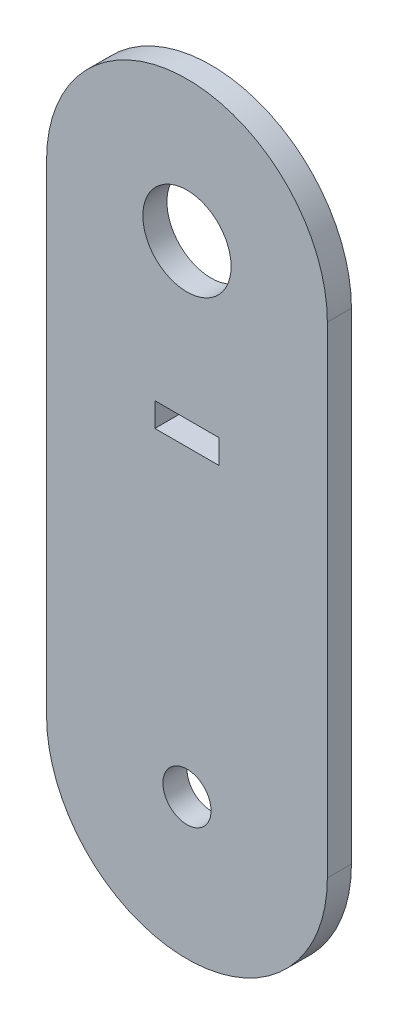
ISO-10303-21;
HEADER;
FILE_DESCRIPTION(('STEP AP214'),'2;1');
FILE_NAME('part.step','',(''),(''),'','','');
FILE_SCHEMA(('AUTOMOTIVE_DESIGN { 1 0 10303 214 1 1 1 1 }'));
ENDSEC;
DATA;
#1=APPLICATION_CONTEXT('core data for automotive mechanical design processes');
#2=APPLICATION_PROTOCOL_DEFINITION('international standard','automotive_design',2000,#1);
#3=PRODUCT_CONTEXT('',#1,'mechanical');
#4=PRODUCT('Part','Part','',(#3));
#5=PRODUCT_RELATED_PRODUCT_CATEGORY('part','',(#4));
#6=PRODUCT_DEFINITION_FORMATION('','',#4);
#7=PRODUCT_DEFINITION_CONTEXT('part definition',#1,'design');
#8=PRODUCT_DEFINITION('design','',#6,#7);
#9=PRODUCT_DEFINITION_SHAPE('','',#8);
#10=(LENGTH_UNIT() NAMED_UNIT(*) SI_UNIT(.MILLI.,.METRE.));
#11=(NAMED_UNIT(*) PLANE_ANGLE_UNIT() SI_UNIT($,.RADIAN.));
#12=(NAMED_UNIT(*) SI_UNIT($,.STERADIAN.) SOLID_ANGLE_UNIT());
#13=UNCERTAINTY_MEASURE_WITH_UNIT(LENGTH_MEASURE(1.E-05),#10,'distance_accuracy_value','');
#14=(GEOMETRIC_REPRESENTATION_CONTEXT(3) GLOBAL_UNCERTAINTY_ASSIGNED_CONTEXT((#13)) GLOBAL_UNIT_ASSIGNED_CONTEXT((#10,
#11,#12)) REPRESENTATION_CONTEXT('',''));
#15=CARTESIAN_POINT('',(0.,0.,0.));
#16=DIRECTION('',(0.,0.,1.));
#17=DIRECTION('',(1.,0.,0.));
#18=AXIS2_PLACEMENT_3D('',#15,#16,#17);
#19=CARTESIAN_POINT('',(0.,30.,3.));
#20=DIRECTION('',(0.,0.,-1.));
#21=DIRECTION('',(-1.,0.,0.));
#22=AXIS2_PLACEMENT_3D('',#19,#20,#21);
#23=PLANE('',#22);
#24=DIRECTION('',(-1.,0.,0.));
#25=VECTOR('',#24,1.);
#26=CARTESIAN_POINT('',(4.,10.77,3.));
#27=LINE('',#26,#25);
#28=CARTESIAN_POINT('',(4.,10.77,3.));
#29=VERTEX_POINT('',#28);
#30=CARTESIAN_POINT('',(-4.,10.77,3.));
#31=VERTEX_POINT('',#30);
#32=EDGE_CURVE('E117',#29,#31,#27,.T.);
#33=ORIENTED_EDGE('',*,*,#32,.F.);
#34=DIRECTION('',(0.,1.,0.));
#35=VECTOR('',#34,1.);
#36=CARTESIAN_POINT('',(4.,10.77,3.));
#37=LINE('',#36,#35);
#38=CARTESIAN_POINT('',(4.,7.77,3.));
#39=VERTEX_POINT('',#38);
#40=EDGE_CURVE('E48',#39,#29,#37,.T.);
#41=ORIENTED_EDGE('',*,*,#40,.F.);
#42=DIRECTION('',(1.,0.,0.));
#43=VECTOR('',#42,1.);
#44=CARTESIAN_POINT('',(4.,7.77,3.));
#45=LINE('',#44,#43);
#46=CARTESIAN_POINT('',(-4.,7.77,3.));
#47=VERTEX_POINT('',#46);
#48=EDGE_CURVE('E110',#47,#39,#45,.T.);
#49=ORIENTED_EDGE('',*,*,#48,.F.);
#50=DIRECTION('',(0.,-1.,0.));
#51=VECTOR('',#50,1.);
#52=CARTESIAN_POINT('',(-4.,10.77,3.));
#53=LINE('',#52,#51);
#54=EDGE_CURVE('E124',#31,#47,#53,.T.);
#55=ORIENTED_EDGE('',*,*,#54,.F.);
#56=EDGE_LOOP('',(#33,#41,#49,#55));
#57=FACE_BOUND('',#56,.T.);
#58=CARTESIAN_POINT('',(0.,30.,3.));
#59=DIRECTION('',(0.,0.,1.));
#60=DIRECTION('',(-1.,0.,0.));
#61=AXIS2_PLACEMENT_3D('',#58,#59,#60);
#62=CIRCLE('',#61,17.5);
#63=CARTESIAN_POINT('',(17.5,30.,3.));
#64=VERTEX_POINT('',#63);
#65=CARTESIAN_POINT('',(-17.5,30.,3.));
#66=VERTEX_POINT('',#65);
#67=EDGE_CURVE('E145',#64,#66,#62,.T.);
#68=ORIENTED_EDGE('',*,*,#67,.T.);
#69=DIRECTION('',(0.,-1.,0.));
#70=VECTOR('',#69,1.);
#71=CARTESIAN_POINT('',(-17.5,-30.,3.));
#72=LINE('',#71,#70);
#73=CARTESIAN_POINT('',(-17.5,-30.,3.));
#74=VERTEX_POINT('',#73);
#75=EDGE_CURVE('E148',#66,#74,#72,.T.);
#76=ORIENTED_EDGE('',*,*,#75,.T.);
#77=CARTESIAN_POINT('',(0.,-30.,3.));
#78=DIRECTION('',(0.,0.,1.));
#79=DIRECTION('',(1.,0.,0.));
#80=AXIS2_PLACEMENT_3D('',#77,#78,#79);
#81=CIRCLE('',#80,17.5);
#82=CARTESIAN_POINT('',(17.5,-30.,3.));
#83=VERTEX_POINT('',#82);
#84=EDGE_CURVE('E151',#74,#83,#81,.T.);
#85=ORIENTED_EDGE('',*,*,#84,.T.);
#86=DIRECTION('',(0.,1.,0.));
#87=VECTOR('',#86,1.);
#88=CARTESIAN_POINT('',(17.5,-30.,3.));
#89=LINE('',#88,#87);
#90=EDGE_CURVE('E153',#83,#64,#89,.T.);
#91=ORIENTED_EDGE('',*,*,#90,.T.);
#92=EDGE_LOOP('',(#68,#76,#85,#91));
#93=FACE_BOUND('',#92,.T.);
#94=CARTESIAN_POINT('',(0.,-30.,3.));
#95=DIRECTION('',(0.,0.,1.));
#96=DIRECTION('',(1.,0.,0.));
#97=AXIS2_PLACEMENT_3D('',#94,#95,#96);
#98=CIRCLE('',#97,3.);
#99=CARTESIAN_POINT('',(3.00000000000001,-30.,3.));
#100=VERTEX_POINT('',#99);
#101=EDGE_CURVE('E139',#100,#100,#98,.T.);
#102=ORIENTED_EDGE('',*,*,#101,.F.);
#103=EDGE_LOOP('',(#102));
#104=FACE_BOUND('',#103,.T.);
#105=CARTESIAN_POINT('',(0.,30.,3.));
#106=DIRECTION('',(0.,0.,1.));
#107=DIRECTION('',(1.,0.,0.));
#108=AXIS2_PLACEMENT_3D('',#105,#106,#107);
#109=CIRCLE('',#108,5.5);
#110=CARTESIAN_POINT('',(5.50000000000001,30.,3.));
#111=VERTEX_POINT('',#110);
#112=EDGE_CURVE('E133',#111,#111,#109,.T.);
#113=ORIENTED_EDGE('',*,*,#112,.F.);
#114=EDGE_LOOP('',(#113));
#115=FACE_BOUND('',#114,.T.);
#116=ADVANCED_FACE('F33',(#57,#93,#104,#115),#23,.F.);
#117=CARTESIAN_POINT('',(0.,30.,0.));
#118=DIRECTION('',(0.,0.,-1.));
#119=DIRECTION('',(-1.,0.,0.));
#120=AXIS2_PLACEMENT_3D('',#117,#118,#119);
#121=PLANE('',#120);
#122=DIRECTION('',(0.,1.,0.));
#123=VECTOR('',#122,1.);
#124=CARTESIAN_POINT('',(4.,10.77,0.));
#125=LINE('',#124,#123);
#126=CARTESIAN_POINT('',(4.,7.77,0.));
#127=VERTEX_POINT('',#126);
#128=CARTESIAN_POINT('',(4.,10.77,0.));
#129=VERTEX_POINT('',#128);
#130=EDGE_CURVE('E108',#127,#129,#125,.T.);
#131=ORIENTED_EDGE('',*,*,#130,.T.);
#132=DIRECTION('',(-1.,0.,0.));
#133=VECTOR('',#132,1.);
#134=CARTESIAN_POINT('',(4.,10.77,0.));
#135=LINE('',#134,#133);
#136=CARTESIAN_POINT('',(-4.,10.77,0.));
#137=VERTEX_POINT('',#136);
#138=EDGE_CURVE('E97',#129,#137,#135,.T.);
#139=ORIENTED_EDGE('',*,*,#138,.T.);
#140=DIRECTION('',(0.,-1.,0.));
#141=VECTOR('',#140,1.);
#142=CARTESIAN_POINT('',(-4.,10.77,0.));
#143=LINE('',#142,#141);
#144=CARTESIAN_POINT('',(-4.,7.77,0.));
#145=VERTEX_POINT('',#144);
#146=EDGE_CURVE('E119',#137,#145,#143,.T.);
#147=ORIENTED_EDGE('',*,*,#146,.T.);
#148=DIRECTION('',(1.,0.,0.));
#149=VECTOR('',#148,1.);
#150=CARTESIAN_POINT('',(4.,7.77,0.));
#151=LINE('',#150,#149);
#152=EDGE_CURVE('E115',#145,#127,#151,.T.);
#153=ORIENTED_EDGE('',*,*,#152,.T.);
#154=EDGE_LOOP('',(#131,#139,#147,#153));
#155=FACE_BOUND('',#154,.T.);
#156=CARTESIAN_POINT('',(0.,-30.,0.));
#157=DIRECTION('',(0.,0.,1.));
#158=DIRECTION('',(1.,0.,0.));
#159=AXIS2_PLACEMENT_3D('',#156,#157,#158);
#160=CIRCLE('',#159,3.);
#161=CARTESIAN_POINT('',(3.00000000000001,-30.,0.));
#162=VERTEX_POINT('',#161);
#163=EDGE_CURVE('E136',#162,#162,#160,.T.);
#164=ORIENTED_EDGE('',*,*,#163,.T.);
#165=EDGE_LOOP('',(#164));
#166=FACE_BOUND('',#165,.T.);
#167=CARTESIAN_POINT('',(0.,30.,0.));
#168=DIRECTION('',(0.,0.,1.));
#169=DIRECTION('',(-1.,0.,0.));
#170=AXIS2_PLACEMENT_3D('',#167,#168,#169);
#171=CIRCLE('',#170,17.5);
#172=CARTESIAN_POINT('',(17.5,30.,0.));
#173=VERTEX_POINT('',#172);
#174=CARTESIAN_POINT('',(-17.5,30.,0.));
#175=VERTEX_POINT('',#174);
#176=EDGE_CURVE('E142',#173,#175,#171,.T.);
#177=ORIENTED_EDGE('',*,*,#176,.F.);
#178=DIRECTION('',(0.,1.,0.));
#179=VECTOR('',#178,1.);
#180=CARTESIAN_POINT('',(17.5,-30.,0.));
#181=LINE('',#180,#179);
#182=CARTESIAN_POINT('',(17.5,-30.,0.));
#183=VERTEX_POINT('',#182);
#184=EDGE_CURVE('E149',#183,#173,#181,.T.);
#185=ORIENTED_EDGE('',*,*,#184,.F.);
#186=CARTESIAN_POINT('',(0.,-30.,0.));
#187=DIRECTION('',(0.,0.,1.));
#188=DIRECTION('',(1.,0.,0.));
#189=AXIS2_PLACEMENT_3D('',#186,#187,#188);
#190=CIRCLE('',#189,17.5);
#191=CARTESIAN_POINT('',(-17.5,-30.,0.));
#192=VERTEX_POINT('',#191);
#193=EDGE_CURVE('E160',#192,#183,#190,.T.);
#194=ORIENTED_EDGE('',*,*,#193,.F.);
#195=DIRECTION('',(0.,-1.,0.));
#196=VECTOR('',#195,1.);
#197=CARTESIAN_POINT('',(-17.5,-30.,0.));
#198=LINE('',#197,#196);
#199=EDGE_CURVE('E158',#175,#192,#198,.T.);
#200=ORIENTED_EDGE('',*,*,#199,.F.);
#201=EDGE_LOOP('',(#177,#185,#194,#200));
#202=FACE_BOUND('',#201,.T.);
#203=CARTESIAN_POINT('',(0.,30.,0.));
#204=DIRECTION('',(0.,0.,1.));
#205=DIRECTION('',(1.,0.,0.));
#206=AXIS2_PLACEMENT_3D('',#203,#204,#205);
#207=CIRCLE('',#206,5.5);
#208=CARTESIAN_POINT('',(5.50000000000001,30.,0.));
#209=VERTEX_POINT('',#208);
#210=EDGE_CURVE('E104',#209,#209,#207,.T.);
#211=ORIENTED_EDGE('',*,*,#210,.T.);
#212=EDGE_LOOP('',(#211));
#213=FACE_BOUND('',#212,.T.);
#214=ADVANCED_FACE('F113',(#155,#166,#202,#213),#121,.T.);
#215=CARTESIAN_POINT('',(0.,30.,3.));
#216=DIRECTION('',(0.,0.,-1.));
#217=DIRECTION('',(-1.,0.,0.));
#218=AXIS2_PLACEMENT_3D('',#215,#216,#217);
#219=CYLINDRICAL_SURFACE('',#218,17.5);
#220=ORIENTED_EDGE('',*,*,#176,.T.);
#221=DIRECTION('',(0.,0.,-1.));
#222=VECTOR('',#221,1.);
#223=CARTESIAN_POINT('',(-17.5,30.,3.));
#224=LINE('',#223,#222);
#225=EDGE_CURVE('E11',#66,#175,#224,.T.);
#226=ORIENTED_EDGE('',*,*,#225,.F.);
#227=ORIENTED_EDGE('',*,*,#67,.F.);
#228=DIRECTION('',(0.,0.,-1.));
#229=VECTOR('',#228,1.);
#230=CARTESIAN_POINT('',(17.5,30.,3.));
#231=LINE('',#230,#229);
#232=EDGE_CURVE('E155',#64,#173,#231,.T.);
#233=ORIENTED_EDGE('',*,*,#232,.T.);
#234=EDGE_LOOP('',(#220,#226,#227,#233));
#235=FACE_BOUND('',#234,.T.);
#236=ADVANCED_FACE('F35',(#235),#219,.T.);
#237=CARTESIAN_POINT('',(-17.5,-30.,3.));
#238=DIRECTION('',(1.,0.,0.));
#239=DIRECTION('',(0.,0.,-1.));
#240=AXIS2_PLACEMENT_3D('',#237,#238,#239);
#241=PLANE('',#240);
#242=ORIENTED_EDGE('',*,*,#199,.T.);
#243=DIRECTION('',(0.,0.,-1.));
#244=VECTOR('',#243,1.);
#245=CARTESIAN_POINT('',(-17.5,-30.,3.));
#246=LINE('',#245,#244);
#247=EDGE_CURVE('E41',#74,#192,#246,.T.);
#248=ORIENTED_EDGE('',*,*,#247,.F.);
#249=ORIENTED_EDGE('',*,*,#75,.F.);
#250=ORIENTED_EDGE('',*,*,#225,.T.);
#251=EDGE_LOOP('',(#242,#248,#249,#250));
#252=FACE_BOUND('',#251,.T.);
#253=ADVANCED_FACE('F188',(#252),#241,.F.);
#254=CARTESIAN_POINT('',(0.,-30.,3.));
#255=DIRECTION('',(0.,0.,-1.));
#256=DIRECTION('',(-1.,0.,0.));
#257=AXIS2_PLACEMENT_3D('',#254,#255,#256);
#258=CYLINDRICAL_SURFACE('',#257,17.5);
#259=ORIENTED_EDGE('',*,*,#193,.T.);
#260=DIRECTION('',(0.,0.,-1.));
#261=VECTOR('',#260,1.);
#262=CARTESIAN_POINT('',(17.5,-30.,3.));
#263=LINE('',#262,#261);
#264=EDGE_CURVE('E165',#83,#183,#263,.T.);
#265=ORIENTED_EDGE('',*,*,#264,.F.);
#266=ORIENTED_EDGE('',*,*,#84,.F.);
#267=ORIENTED_EDGE('',*,*,#247,.T.);
#268=EDGE_LOOP('',(#259,#265,#266,#267));
#269=FACE_BOUND('',#268,.T.);
#270=ADVANCED_FACE('F172',(#269),#258,.T.);
#271=CARTESIAN_POINT('',(17.5,-30.,3.));
#272=DIRECTION('',(-1.,0.,0.));
#273=DIRECTION('',(0.,0.,1.));
#274=AXIS2_PLACEMENT_3D('',#271,#272,#273);
#275=PLANE('',#274);
#276=ORIENTED_EDGE('',*,*,#184,.T.);
#277=ORIENTED_EDGE('',*,*,#232,.F.);
#278=ORIENTED_EDGE('',*,*,#90,.F.);
#279=ORIENTED_EDGE('',*,*,#264,.T.);
#280=EDGE_LOOP('',(#276,#277,#278,#279));
#281=FACE_BOUND('',#280,.T.);
#282=ADVANCED_FACE('F181',(#281),#275,.F.);
#283=CARTESIAN_POINT('',(0.,-30.,3.));
#284=DIRECTION('',(0.,0.,-1.));
#285=DIRECTION('',(-1.,0.,0.));
#286=AXIS2_PLACEMENT_3D('',#283,#284,#285);
#287=CYLINDRICAL_SURFACE('',#286,3.);
#288=ORIENTED_EDGE('',*,*,#101,.T.);
#289=EDGE_LOOP('',(#288));
#290=FACE_BOUND('',#289,.T.);
#291=ORIENTED_EDGE('',*,*,#163,.F.);
#292=EDGE_LOOP('',(#291));
#293=FACE_BOUND('',#292,.T.);
#294=ADVANCED_FACE('F203',(#290,#293),#287,.F.);
#295=CARTESIAN_POINT('',(0.,30.,3.));
#296=DIRECTION('',(0.,0.,-1.));
#297=DIRECTION('',(-1.,0.,0.));
#298=AXIS2_PLACEMENT_3D('',#295,#296,#297);
#299=CYLINDRICAL_SURFACE('',#298,5.5);
#300=ORIENTED_EDGE('',*,*,#112,.T.);
#301=EDGE_LOOP('',(#300));
#302=FACE_BOUND('',#301,.T.);
#303=ORIENTED_EDGE('',*,*,#210,.F.);
#304=EDGE_LOOP('',(#303));
#305=FACE_BOUND('',#304,.T.);
#306=ADVANCED_FACE('F210',(#302,#305),#299,.F.);
#307=CARTESIAN_POINT('',(4.,10.77,-0.00100000000000013));
#308=DIRECTION('',(1.,0.,0.));
#309=DIRECTION('',(0.,1.,0.));
#310=AXIS2_PLACEMENT_3D('',#307,#308,#309);
#311=PLANE('',#310);
#312=DIRECTION('',(0.,0.,1.));
#313=VECTOR('',#312,1.);
#314=CARTESIAN_POINT('',(4.,7.77,-0.00100000000000013));
#315=LINE('',#314,#313);
#316=EDGE_CURVE('E105',#127,#39,#315,.T.);
#317=ORIENTED_EDGE('',*,*,#316,.T.);
#318=ORIENTED_EDGE('',*,*,#40,.T.);
#319=DIRECTION('',(0.,0.,1.));
#320=VECTOR('',#319,1.);
#321=CARTESIAN_POINT('',(4.,10.77,-0.00100000000000013));
#322=LINE('',#321,#320);
#323=EDGE_CURVE('E99',#129,#29,#322,.T.);
#324=ORIENTED_EDGE('',*,*,#323,.F.);
#325=ORIENTED_EDGE('',*,*,#130,.F.);
#326=EDGE_LOOP('',(#317,#318,#324,#325));
#327=FACE_BOUND('',#326,.T.);
#328=ADVANCED_FACE('F107',(#327),#311,.F.);
#329=CARTESIAN_POINT('',(4.,7.77,-0.00100000000000013));
#330=DIRECTION('',(0.,-1.,0.));
#331=DIRECTION('',(0.,0.,-1.));
#332=AXIS2_PLACEMENT_3D('',#329,#330,#331);
#333=PLANE('',#332);
#334=DIRECTION('',(0.,0.,1.));
#335=VECTOR('',#334,1.);
#336=CARTESIAN_POINT('',(-4.,7.77,-0.00100000000000013));
#337=LINE('',#336,#335);
#338=EDGE_CURVE('E130',#145,#47,#337,.T.);
#339=ORIENTED_EDGE('',*,*,#338,.T.);
#340=ORIENTED_EDGE('',*,*,#48,.T.);
#341=ORIENTED_EDGE('',*,*,#316,.F.);
#342=ORIENTED_EDGE('',*,*,#152,.F.);
#343=EDGE_LOOP('',(#339,#340,#341,#342));
#344=FACE_BOUND('',#343,.T.);
#345=ADVANCED_FACE('F226',(#344),#333,.F.);
#346=CARTESIAN_POINT('',(-4.,10.77,-0.00100000000000013));
#347=DIRECTION('',(-1.,0.,0.));
#348=DIRECTION('',(0.,-1.,0.));
#349=AXIS2_PLACEMENT_3D('',#346,#347,#348);
#350=PLANE('',#349);
#351=DIRECTION('',(0.,0.,1.));
#352=VECTOR('',#351,1.);
#353=CARTESIAN_POINT('',(-4.,10.77,-0.00100000000000013));
#354=LINE('',#353,#352);
#355=EDGE_CURVE('E56',#137,#31,#354,.T.);
#356=ORIENTED_EDGE('',*,*,#355,.T.);
#357=ORIENTED_EDGE('',*,*,#54,.T.);
#358=ORIENTED_EDGE('',*,*,#338,.F.);
#359=ORIENTED_EDGE('',*,*,#146,.F.);
#360=EDGE_LOOP('',(#356,#357,#358,#359));
#361=FACE_BOUND('',#360,.T.);
#362=ADVANCED_FACE('F231',(#361),#350,.F.);
#363=CARTESIAN_POINT('',(4.,10.77,-0.00100000000000013));
#364=DIRECTION('',(0.,1.,0.));
#365=DIRECTION('',(0.,0.,1.));
#366=AXIS2_PLACEMENT_3D('',#363,#364,#365);
#367=PLANE('',#366);
#368=ORIENTED_EDGE('',*,*,#323,.T.);
#369=ORIENTED_EDGE('',*,*,#32,.T.);
#370=ORIENTED_EDGE('',*,*,#355,.F.);
#371=ORIENTED_EDGE('',*,*,#138,.F.);
#372=EDGE_LOOP('',(#368,#369,#370,#371));
#373=FACE_BOUND('',#372,.T.);
#374=ADVANCED_FACE('F98',(#373),#367,.F.);
#375=CLOSED_SHELL('',(#116,#214,#236,#253,#270,#282,#294,#306,#328,#345,#362,#374));
#376=MANIFOLD_SOLID_BREP('B2',#375);
#377=ADVANCED_BREP_SHAPE_REPRESENTATION('',(#18,#376),#14);
#378=SHAPE_DEFINITION_REPRESENTATION(#9,#377);
ENDSEC;
END-ISO-10303-21;
